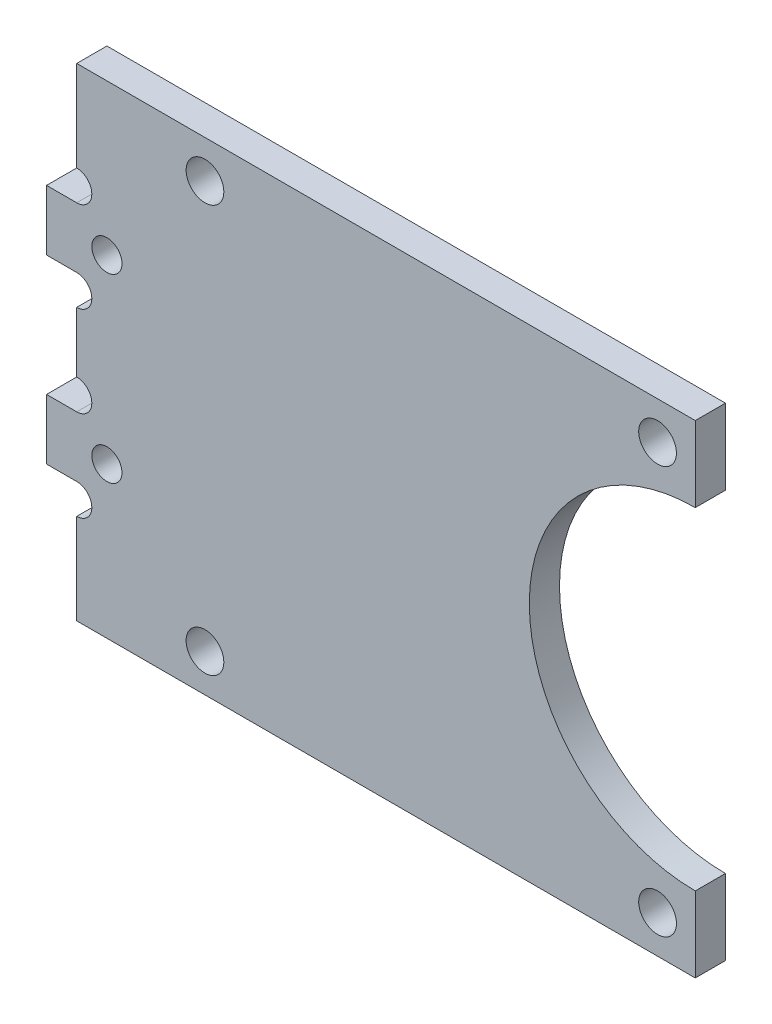
ISO-10303-21;
HEADER;
FILE_DESCRIPTION(('STEP AP214'),'2;1');
FILE_NAME('part.step','',(''),(''),'','','');
FILE_SCHEMA(('AUTOMOTIVE_DESIGN { 1 0 10303 214 1 1 1 1 }'));
ENDSEC;
DATA;
#1=APPLICATION_CONTEXT('core data for automotive mechanical design processes');
#2=APPLICATION_PROTOCOL_DEFINITION('international standard','automotive_design',2000,#1);
#3=PRODUCT_CONTEXT('',#1,'mechanical');
#4=PRODUCT('Part','Part','',(#3));
#5=PRODUCT_RELATED_PRODUCT_CATEGORY('part','',(#4));
#6=PRODUCT_DEFINITION_FORMATION('','',#4);
#7=PRODUCT_DEFINITION_CONTEXT('part definition',#1,'design');
#8=PRODUCT_DEFINITION('design','',#6,#7);
#9=PRODUCT_DEFINITION_SHAPE('','',#8);
#10=(LENGTH_UNIT() NAMED_UNIT(*) SI_UNIT(.MILLI.,.METRE.));
#11=(NAMED_UNIT(*) PLANE_ANGLE_UNIT() SI_UNIT($,.RADIAN.));
#12=(NAMED_UNIT(*) SI_UNIT($,.STERADIAN.) SOLID_ANGLE_UNIT());
#13=UNCERTAINTY_MEASURE_WITH_UNIT(LENGTH_MEASURE(1.E-05),#10,'distance_accuracy_value','');
#14=(GEOMETRIC_REPRESENTATION_CONTEXT(3) GLOBAL_UNCERTAINTY_ASSIGNED_CONTEXT((#13)) GLOBAL_UNIT_ASSIGNED_CONTEXT((#10,
#11,#12)) REPRESENTATION_CONTEXT('',''));
#15=CARTESIAN_POINT('',(0.,0.,0.));
#16=DIRECTION('',(0.,0.,1.));
#17=DIRECTION('',(1.,0.,0.));
#18=AXIS2_PLACEMENT_3D('',#15,#16,#17);
#19=CARTESIAN_POINT('',(15.2837868020581,10.1625,2.));
#20=DIRECTION('',(-1.,0.,0.));
#21=DIRECTION('',(0.,-1.,0.));
#22=AXIS2_PLACEMENT_3D('',#19,#20,#21);
#23=PLANE('',#22);
#24=DIRECTION('',(0.,1.,0.));
#25=VECTOR('',#24,1.);
#26=CARTESIAN_POINT('',(15.2837868020581,10.1625,2.));
#27=LINE('',#26,#25);
#28=CARTESIAN_POINT('',(15.2837868020581,5.1625,2.));
#29=VERTEX_POINT('',#28);
#30=CARTESIAN_POINT('',(15.2837868020581,10.1625,2.));
#31=VERTEX_POINT('',#30);
#32=EDGE_CURVE('E55',#29,#31,#27,.T.);
#33=ORIENTED_EDGE('',*,*,#32,.F.);
#34=DIRECTION('',(0.,0.,-1.));
#35=VECTOR('',#34,1.);
#36=CARTESIAN_POINT('',(15.2837868020581,5.1625,2.));
#37=LINE('',#36,#35);
#38=CARTESIAN_POINT('',(15.2837868020581,5.1625,0.));
#39=VERTEX_POINT('',#38);
#40=EDGE_CURVE('E320',#29,#39,#37,.T.);
#41=ORIENTED_EDGE('',*,*,#40,.T.);
#42=DIRECTION('',(0.,1.,0.));
#43=VECTOR('',#42,1.);
#44=CARTESIAN_POINT('',(15.2837868020581,10.1625,0.));
#45=LINE('',#44,#43);
#46=CARTESIAN_POINT('',(15.2837868020581,10.1625,0.));
#47=VERTEX_POINT('',#46);
#48=EDGE_CURVE('E114',#39,#47,#45,.T.);
#49=ORIENTED_EDGE('',*,*,#48,.T.);
#50=DIRECTION('',(0.,0.,-1.));
#51=VECTOR('',#50,1.);
#52=CARTESIAN_POINT('',(15.2837868020581,10.1625,2.));
#53=LINE('',#52,#51);
#54=EDGE_CURVE('E192',#31,#47,#53,.T.);
#55=ORIENTED_EDGE('',*,*,#54,.F.);
#56=EDGE_LOOP('',(#33,#41,#49,#55));
#57=FACE_BOUND('',#56,.T.);
#58=ADVANCED_FACE('F32',(#57),#23,.F.);
#59=CARTESIAN_POINT('',(-25.7162131979419,3.1625,2.));
#60=DIRECTION('',(0.,0.,1.));
#61=DIRECTION('',(1.,0.,0.));
#62=AXIS2_PLACEMENT_3D('',#59,#60,#61);
#63=PLANE('',#62);
#64=CARTESIAN_POINT('',(15.2837868020581,-5.8375,2.));
#65=DIRECTION('',(0.,0.,-1.));
#66=DIRECTION('',(1.,0.,0.));
#67=AXIS2_PLACEMENT_3D('',#64,#65,#66);
#68=CIRCLE('',#67,11.);
#69=CARTESIAN_POINT('',(15.2837868020581,-16.8375,2.));
#70=VERTEX_POINT('',#69);
#71=EDGE_CURVE('E47',#70,#29,#68,.T.);
#72=ORIENTED_EDGE('',*,*,#71,.T.);
#73=ORIENTED_EDGE('',*,*,#32,.T.);
#74=DIRECTION('',(-1.,0.,0.));
#75=VECTOR('',#74,1.);
#76=CARTESIAN_POINT('',(-17.2162131979419,10.1625,2.));
#77=LINE('',#76,#75);
#78=CARTESIAN_POINT('',(-25.7162131979419,10.1625,2.));
#79=VERTEX_POINT('',#78);
#80=EDGE_CURVE('E119',#31,#79,#77,.T.);
#81=ORIENTED_EDGE('',*,*,#80,.T.);
#82=DIRECTION('',(0.,-1.,0.));
#83=VECTOR('',#82,1.);
#84=CARTESIAN_POINT('',(-25.7162131979419,10.1625,2.));
#85=LINE('',#84,#83);
#86=CARTESIAN_POINT('',(-25.7162131979419,4.1625,2.));
#87=VERTEX_POINT('',#86);
#88=EDGE_CURVE('E368',#79,#87,#85,.T.);
#89=ORIENTED_EDGE('',*,*,#88,.T.);
#90=CARTESIAN_POINT('',(-25.7162131979419,3.1625,2.));
#91=DIRECTION('',(0.,0.,-1.));
#92=DIRECTION('',(1.,0.,0.));
#93=AXIS2_PLACEMENT_3D('',#90,#91,#92);
#94=CIRCLE('',#93,1.);
#95=CARTESIAN_POINT('',(-25.7162131979419,2.1625,2.));
#96=VERTEX_POINT('',#95);
#97=EDGE_CURVE('E265',#87,#96,#94,.T.);
#98=ORIENTED_EDGE('',*,*,#97,.T.);
#99=DIRECTION('',(-1.,0.,0.));
#100=VECTOR('',#99,1.);
#101=CARTESIAN_POINT('',(-25.7162131979419,2.1625,2.));
#102=LINE('',#101,#100);
#103=CARTESIAN_POINT('',(-27.7162131979419,2.1625,2.));
#104=VERTEX_POINT('',#103);
#105=EDGE_CURVE('E287',#96,#104,#102,.T.);
#106=ORIENTED_EDGE('',*,*,#105,.T.);
#107=DIRECTION('',(0.,-1.,0.));
#108=VECTOR('',#107,1.);
#109=CARTESIAN_POINT('',(-27.7162131979419,2.1625,2.));
#110=LINE('',#109,#108);
#111=CARTESIAN_POINT('',(-27.7162131979419,-1.8375,2.));
#112=VERTEX_POINT('',#111);
#113=EDGE_CURVE('E284',#104,#112,#110,.T.);
#114=ORIENTED_EDGE('',*,*,#113,.T.);
#115=DIRECTION('',(1.,0.,0.));
#116=VECTOR('',#115,1.);
#117=CARTESIAN_POINT('',(-25.7162131979419,-1.8375,2.));
#118=LINE('',#117,#116);
#119=CARTESIAN_POINT('',(-25.7162131979419,-1.8375,2.));
#120=VERTEX_POINT('',#119);
#121=EDGE_CURVE('E286',#112,#120,#118,.T.);
#122=ORIENTED_EDGE('',*,*,#121,.T.);
#123=CARTESIAN_POINT('',(-25.7162131979419,-2.8375,2.));
#124=DIRECTION('',(0.,0.,-1.));
#125=DIRECTION('',(-1.,0.,0.));
#126=AXIS2_PLACEMENT_3D('',#123,#124,#125);
#127=CIRCLE('',#126,1.);
#128=CARTESIAN_POINT('',(-25.7162131979419,-3.8375,2.));
#129=VERTEX_POINT('',#128);
#130=EDGE_CURVE('E289',#120,#129,#127,.T.);
#131=ORIENTED_EDGE('',*,*,#130,.T.);
#132=DIRECTION('',(0.,-1.,0.));
#133=VECTOR('',#132,1.);
#134=CARTESIAN_POINT('',(-25.7162131979419,-3.8375,2.));
#135=LINE('',#134,#133);
#136=CARTESIAN_POINT('',(-25.7162131979419,-7.8375,2.));
#137=VERTEX_POINT('',#136);
#138=EDGE_CURVE('E295',#129,#137,#135,.T.);
#139=ORIENTED_EDGE('',*,*,#138,.T.);
#140=CARTESIAN_POINT('',(-25.7162131979419,-8.8375,2.));
#141=DIRECTION('',(0.,0.,-1.));
#142=DIRECTION('',(1.,0.,0.));
#143=AXIS2_PLACEMENT_3D('',#140,#141,#142);
#144=CIRCLE('',#143,1.);
#145=CARTESIAN_POINT('',(-25.7162131979419,-9.8375,2.));
#146=VERTEX_POINT('',#145);
#147=EDGE_CURVE('E297',#137,#146,#144,.T.);
#148=ORIENTED_EDGE('',*,*,#147,.T.);
#149=DIRECTION('',(-1.,0.,0.));
#150=VECTOR('',#149,1.);
#151=CARTESIAN_POINT('',(-25.7162131979419,-9.8375,2.));
#152=LINE('',#151,#150);
#153=CARTESIAN_POINT('',(-27.7162131979419,-9.8375,2.));
#154=VERTEX_POINT('',#153);
#155=EDGE_CURVE('E299',#146,#154,#152,.T.);
#156=ORIENTED_EDGE('',*,*,#155,.T.);
#157=DIRECTION('',(0.,-1.,0.));
#158=VECTOR('',#157,1.);
#159=CARTESIAN_POINT('',(-27.7162131979419,-9.8375,2.));
#160=LINE('',#159,#158);
#161=CARTESIAN_POINT('',(-27.7162131979419,-13.8375,2.));
#162=VERTEX_POINT('',#161);
#163=EDGE_CURVE('E301',#154,#162,#160,.T.);
#164=ORIENTED_EDGE('',*,*,#163,.T.);
#165=DIRECTION('',(1.,0.,0.));
#166=VECTOR('',#165,1.);
#167=CARTESIAN_POINT('',(-25.7162131979419,-13.8375,2.));
#168=LINE('',#167,#166);
#169=CARTESIAN_POINT('',(-25.7162131979419,-13.8375,2.));
#170=VERTEX_POINT('',#169);
#171=EDGE_CURVE('E303',#162,#170,#168,.T.);
#172=ORIENTED_EDGE('',*,*,#171,.T.);
#173=CARTESIAN_POINT('',(-25.7162131979419,-14.8375,2.));
#174=DIRECTION('',(0.,0.,-1.));
#175=DIRECTION('',(-1.,0.,0.));
#176=AXIS2_PLACEMENT_3D('',#173,#174,#175);
#177=CIRCLE('',#176,0.999999999999999);
#178=CARTESIAN_POINT('',(-25.7162131979419,-15.8375,2.));
#179=VERTEX_POINT('',#178);
#180=EDGE_CURVE('E169',#170,#179,#177,.T.);
#181=ORIENTED_EDGE('',*,*,#180,.T.);
#182=DIRECTION('',(0.,-1.,0.));
#183=VECTOR('',#182,1.);
#184=CARTESIAN_POINT('',(-25.7162131979419,-15.8375,2.));
#185=LINE('',#184,#183);
#186=CARTESIAN_POINT('',(-25.7162131979419,-21.8375,2.));
#187=VERTEX_POINT('',#186);
#188=EDGE_CURVE('E160',#179,#187,#185,.T.);
#189=ORIENTED_EDGE('',*,*,#188,.T.);
#190=DIRECTION('',(1.,0.,0.));
#191=VECTOR('',#190,1.);
#192=CARTESIAN_POINT('',(-19.7162131979419,-21.8375,2.));
#193=LINE('',#192,#191);
#194=CARTESIAN_POINT('',(15.2837868020581,-21.8375,2.));
#195=VERTEX_POINT('',#194);
#196=EDGE_CURVE('E166',#187,#195,#193,.T.);
#197=ORIENTED_EDGE('',*,*,#196,.T.);
#198=EDGE_CURVE('E188',#195,#70,#27,.T.);
#199=ORIENTED_EDGE('',*,*,#198,.T.);
#200=EDGE_LOOP('',(#72,#73,#81,#89,#98,#106,#114,#122,#131,#139,#148,#156,#164,#172,#181,#189,
#197,#199));
#201=FACE_BOUND('',#200,.T.);
#202=CARTESIAN_POINT('',(-23.7162131979419,-11.8375,2.));
#203=DIRECTION('',(0.,0.,1.));
#204=DIRECTION('',(1.,0.,0.));
#205=AXIS2_PLACEMENT_3D('',#202,#203,#204);
#206=CIRCLE('',#205,1.);
#207=CARTESIAN_POINT('',(-22.7162131979419,-11.8375,2.));
#208=VERTEX_POINT('',#207);
#209=EDGE_CURVE('E339',#208,#208,#206,.T.);
#210=ORIENTED_EDGE('',*,*,#209,.F.);
#211=EDGE_LOOP('',(#210));
#212=FACE_BOUND('',#211,.T.);
#213=CARTESIAN_POINT('',(12.7837868020581,7.6625,2.));
#214=DIRECTION('',(0.,0.,1.));
#215=DIRECTION('',(1.,0.,0.));
#216=AXIS2_PLACEMENT_3D('',#213,#214,#215);
#217=CIRCLE('',#216,1.25);
#218=CARTESIAN_POINT('',(14.0337868020581,7.6625,2.));
#219=VERTEX_POINT('',#218);
#220=EDGE_CURVE('E351',#219,#219,#217,.T.);
#221=ORIENTED_EDGE('',*,*,#220,.F.);
#222=EDGE_LOOP('',(#221));
#223=FACE_BOUND('',#222,.T.);
#224=CARTESIAN_POINT('',(-17.2162131979419,7.6625,2.));
#225=DIRECTION('',(0.,0.,1.));
#226=DIRECTION('',(1.,0.,0.));
#227=AXIS2_PLACEMENT_3D('',#224,#225,#226);
#228=CIRCLE('',#227,1.25);
#229=CARTESIAN_POINT('',(-15.9662131979419,7.6625,2.));
#230=VERTEX_POINT('',#229);
#231=EDGE_CURVE('E196',#230,#230,#228,.T.);
#232=ORIENTED_EDGE('',*,*,#231,.F.);
#233=EDGE_LOOP('',(#232));
#234=FACE_BOUND('',#233,.T.);
#235=CARTESIAN_POINT('',(12.7837868020581,-19.3375,2.));
#236=DIRECTION('',(0.,0.,1.));
#237=DIRECTION('',(1.,0.,0.));
#238=AXIS2_PLACEMENT_3D('',#235,#236,#237);
#239=CIRCLE('',#238,1.25);
#240=CARTESIAN_POINT('',(14.0337868020581,-19.3375,2.));
#241=VERTEX_POINT('',#240);
#242=EDGE_CURVE('E357',#241,#241,#239,.T.);
#243=ORIENTED_EDGE('',*,*,#242,.F.);
#244=EDGE_LOOP('',(#243));
#245=FACE_BOUND('',#244,.T.);
#246=CARTESIAN_POINT('',(-17.2162131979419,-19.3375,2.));
#247=DIRECTION('',(0.,0.,1.));
#248=DIRECTION('',(1.,0.,0.));
#249=AXIS2_PLACEMENT_3D('',#246,#247,#248);
#250=CIRCLE('',#249,1.25);
#251=CARTESIAN_POINT('',(-15.9662131979419,-19.3375,2.));
#252=VERTEX_POINT('',#251);
#253=EDGE_CURVE('E345',#252,#252,#250,.T.);
#254=ORIENTED_EDGE('',*,*,#253,.F.);
#255=EDGE_LOOP('',(#254));
#256=FACE_BOUND('',#255,.T.);
#257=CARTESIAN_POINT('',(-23.7162131979419,0.162500000000001,2.));
#258=DIRECTION('',(0.,0.,1.));
#259=DIRECTION('',(1.,0.,0.));
#260=AXIS2_PLACEMENT_3D('',#257,#258,#259);
#261=CIRCLE('',#260,1.);
#262=CARTESIAN_POINT('',(-22.7162131979419,0.162500000000001,2.));
#263=VERTEX_POINT('',#262);
#264=EDGE_CURVE('E331',#263,#263,#261,.T.);
#265=ORIENTED_EDGE('',*,*,#264,.F.);
#266=EDGE_LOOP('',(#265));
#267=FACE_BOUND('',#266,.T.);
#268=ADVANCED_FACE('F162',(#201,#212,#223,#234,#245,#256,#267),#63,.T.);
#269=CARTESIAN_POINT('',(-25.7162131979419,3.1625,0.));
#270=DIRECTION('',(0.,0.,1.));
#271=DIRECTION('',(1.,0.,0.));
#272=AXIS2_PLACEMENT_3D('',#269,#270,#271);
#273=PLANE('',#272);
#274=ORIENTED_EDGE('',*,*,#48,.F.);
#275=CARTESIAN_POINT('',(15.2837868020581,-5.8375,0.));
#276=DIRECTION('',(0.,0.,-1.));
#277=DIRECTION('',(1.,0.,0.));
#278=AXIS2_PLACEMENT_3D('',#275,#276,#277);
#279=CIRCLE('',#278,11.);
#280=CARTESIAN_POINT('',(15.2837868020581,-16.8375,0.));
#281=VERTEX_POINT('',#280);
#282=EDGE_CURVE('E321',#281,#39,#279,.T.);
#283=ORIENTED_EDGE('',*,*,#282,.F.);
#284=CARTESIAN_POINT('',(15.2837868020581,-21.8375,0.));
#285=VERTEX_POINT('',#284);
#286=EDGE_CURVE('E221',#285,#281,#45,.T.);
#287=ORIENTED_EDGE('',*,*,#286,.F.);
#288=DIRECTION('',(1.,0.,0.));
#289=VECTOR('',#288,1.);
#290=CARTESIAN_POINT('',(15.2837868020581,-21.8375,0.));
#291=LINE('',#290,#289);
#292=CARTESIAN_POINT('',(-25.7162131979419,-21.8375,0.));
#293=VERTEX_POINT('',#292);
#294=EDGE_CURVE('E219',#293,#285,#291,.T.);
#295=ORIENTED_EDGE('',*,*,#294,.F.);
#296=DIRECTION('',(0.,-1.,0.));
#297=VECTOR('',#296,1.);
#298=CARTESIAN_POINT('',(-25.7162131979419,-15.8375,0.));
#299=LINE('',#298,#297);
#300=CARTESIAN_POINT('',(-25.7162131979419,-15.8375,0.));
#301=VERTEX_POINT('',#300);
#302=EDGE_CURVE('E179',#301,#293,#299,.T.);
#303=ORIENTED_EDGE('',*,*,#302,.F.);
#304=CARTESIAN_POINT('',(-25.7162131979419,-14.8375,0.));
#305=DIRECTION('',(0.,0.,-1.));
#306=DIRECTION('',(-1.,0.,0.));
#307=AXIS2_PLACEMENT_3D('',#304,#305,#306);
#308=CIRCLE('',#307,0.999999999999999);
#309=CARTESIAN_POINT('',(-25.7162131979419,-13.8375,0.));
#310=VERTEX_POINT('',#309);
#311=EDGE_CURVE('E216',#310,#301,#308,.T.);
#312=ORIENTED_EDGE('',*,*,#311,.F.);
#313=DIRECTION('',(1.,0.,0.));
#314=VECTOR('',#313,1.);
#315=CARTESIAN_POINT('',(-25.7162131979419,-13.8375,0.));
#316=LINE('',#315,#314);
#317=CARTESIAN_POINT('',(-27.7162131979419,-13.8375,0.));
#318=VERTEX_POINT('',#317);
#319=EDGE_CURVE('E214',#318,#310,#316,.T.);
#320=ORIENTED_EDGE('',*,*,#319,.F.);
#321=DIRECTION('',(0.,-1.,0.));
#322=VECTOR('',#321,1.);
#323=CARTESIAN_POINT('',(-27.7162131979419,-9.8375,0.));
#324=LINE('',#323,#322);
#325=CARTESIAN_POINT('',(-27.7162131979419,-9.8375,0.));
#326=VERTEX_POINT('',#325);
#327=EDGE_CURVE('E212',#326,#318,#324,.T.);
#328=ORIENTED_EDGE('',*,*,#327,.F.);
#329=DIRECTION('',(-1.,0.,0.));
#330=VECTOR('',#329,1.);
#331=CARTESIAN_POINT('',(-25.7162131979419,-9.8375,0.));
#332=LINE('',#331,#330);
#333=CARTESIAN_POINT('',(-25.7162131979419,-9.8375,0.));
#334=VERTEX_POINT('',#333);
#335=EDGE_CURVE('E210',#334,#326,#332,.T.);
#336=ORIENTED_EDGE('',*,*,#335,.F.);
#337=CARTESIAN_POINT('',(-25.7162131979419,-8.8375,0.));
#338=DIRECTION('',(0.,0.,-1.));
#339=DIRECTION('',(1.,0.,0.));
#340=AXIS2_PLACEMENT_3D('',#337,#338,#339);
#341=CIRCLE('',#340,1.);
#342=CARTESIAN_POINT('',(-25.7162131979419,-7.8375,0.));
#343=VERTEX_POINT('',#342);
#344=EDGE_CURVE('E208',#343,#334,#341,.T.);
#345=ORIENTED_EDGE('',*,*,#344,.F.);
#346=DIRECTION('',(0.,-1.,0.));
#347=VECTOR('',#346,1.);
#348=CARTESIAN_POINT('',(-25.7162131979419,-3.8375,0.));
#349=LINE('',#348,#347);
#350=CARTESIAN_POINT('',(-25.7162131979419,-3.8375,0.));
#351=VERTEX_POINT('',#350);
#352=EDGE_CURVE('E206',#351,#343,#349,.T.);
#353=ORIENTED_EDGE('',*,*,#352,.F.);
#354=CARTESIAN_POINT('',(-25.7162131979419,-2.8375,0.));
#355=DIRECTION('',(0.,0.,-1.));
#356=DIRECTION('',(-1.,0.,0.));
#357=AXIS2_PLACEMENT_3D('',#354,#355,#356);
#358=CIRCLE('',#357,1.);
#359=CARTESIAN_POINT('',(-25.7162131979419,-1.8375,0.));
#360=VERTEX_POINT('',#359);
#361=EDGE_CURVE('E204',#360,#351,#358,.T.);
#362=ORIENTED_EDGE('',*,*,#361,.F.);
#363=DIRECTION('',(1.,0.,0.));
#364=VECTOR('',#363,1.);
#365=CARTESIAN_POINT('',(-25.7162131979419,-1.8375,0.));
#366=LINE('',#365,#364);
#367=CARTESIAN_POINT('',(-27.7162131979419,-1.8375,0.));
#368=VERTEX_POINT('',#367);
#369=EDGE_CURVE('E202',#368,#360,#366,.T.);
#370=ORIENTED_EDGE('',*,*,#369,.F.);
#371=DIRECTION('',(0.,-1.,0.));
#372=VECTOR('',#371,1.);
#373=CARTESIAN_POINT('',(-27.7162131979419,2.1625,0.));
#374=LINE('',#373,#372);
#375=CARTESIAN_POINT('',(-27.7162131979419,2.1625,0.));
#376=VERTEX_POINT('',#375);
#377=EDGE_CURVE('E200',#376,#368,#374,.T.);
#378=ORIENTED_EDGE('',*,*,#377,.F.);
#379=DIRECTION('',(-1.,0.,0.));
#380=VECTOR('',#379,1.);
#381=CARTESIAN_POINT('',(-25.7162131979419,2.1625,0.));
#382=LINE('',#381,#380);
#383=CARTESIAN_POINT('',(-25.7162131979419,2.1625,0.));
#384=VERTEX_POINT('',#383);
#385=EDGE_CURVE('E198',#384,#376,#382,.T.);
#386=ORIENTED_EDGE('',*,*,#385,.F.);
#387=CARTESIAN_POINT('',(-25.7162131979419,3.1625,0.));
#388=DIRECTION('',(0.,0.,-1.));
#389=DIRECTION('',(1.,0.,0.));
#390=AXIS2_PLACEMENT_3D('',#387,#388,#389);
#391=CIRCLE('',#390,1.);
#392=CARTESIAN_POINT('',(-25.7162131979419,4.1625,0.));
#393=VERTEX_POINT('',#392);
#394=EDGE_CURVE('E195',#393,#384,#391,.T.);
#395=ORIENTED_EDGE('',*,*,#394,.F.);
#396=DIRECTION('',(0.,-1.,0.));
#397=VECTOR('',#396,1.);
#398=CARTESIAN_POINT('',(-25.7162131979419,10.1625,0.));
#399=LINE('',#398,#397);
#400=CARTESIAN_POINT('',(-25.7162131979419,10.1625,0.));
#401=VERTEX_POINT('',#400);
#402=EDGE_CURVE('E193',#401,#393,#399,.T.);
#403=ORIENTED_EDGE('',*,*,#402,.F.);
#404=DIRECTION('',(-1.,0.,0.));
#405=VECTOR('',#404,1.);
#406=CARTESIAN_POINT('',(-17.2162131979419,10.1625,0.));
#407=LINE('',#406,#405);
#408=EDGE_CURVE('E224',#47,#401,#407,.T.);
#409=ORIENTED_EDGE('',*,*,#408,.F.);
#410=EDGE_LOOP('',(#274,#283,#287,#295,#303,#312,#320,#328,#336,#345,#353,#362,#370,#378,#386,
#395,#403,#409));
#411=FACE_BOUND('',#410,.T.);
#412=CARTESIAN_POINT('',(-17.2162131979419,7.6625,0.));
#413=DIRECTION('',(0.,0.,1.));
#414=DIRECTION('',(1.,0.,0.));
#415=AXIS2_PLACEMENT_3D('',#412,#413,#414);
#416=CIRCLE('',#415,1.25);
#417=CARTESIAN_POINT('',(-15.9662131979419,7.6625,0.));
#418=VERTEX_POINT('',#417);
#419=EDGE_CURVE('E360',#418,#418,#416,.T.);
#420=ORIENTED_EDGE('',*,*,#419,.T.);
#421=EDGE_LOOP('',(#420));
#422=FACE_BOUND('',#421,.T.);
#423=CARTESIAN_POINT('',(12.7837868020581,-19.3375,0.));
#424=DIRECTION('',(0.,0.,1.));
#425=DIRECTION('',(1.,0.,0.));
#426=AXIS2_PLACEMENT_3D('',#423,#424,#425);
#427=CIRCLE('',#426,1.25);
#428=CARTESIAN_POINT('',(14.0337868020581,-19.3375,0.));
#429=VERTEX_POINT('',#428);
#430=EDGE_CURVE('E354',#429,#429,#427,.T.);
#431=ORIENTED_EDGE('',*,*,#430,.T.);
#432=EDGE_LOOP('',(#431));
#433=FACE_BOUND('',#432,.T.);
#434=CARTESIAN_POINT('',(12.7837868020581,7.6625,0.));
#435=DIRECTION('',(0.,0.,1.));
#436=DIRECTION('',(1.,0.,0.));
#437=AXIS2_PLACEMENT_3D('',#434,#435,#436);
#438=CIRCLE('',#437,1.25);
#439=CARTESIAN_POINT('',(14.0337868020581,7.6625,0.));
#440=VERTEX_POINT('',#439);
#441=EDGE_CURVE('E348',#440,#440,#438,.T.);
#442=ORIENTED_EDGE('',*,*,#441,.T.);
#443=EDGE_LOOP('',(#442));
#444=FACE_BOUND('',#443,.T.);
#445=CARTESIAN_POINT('',(-17.2162131979419,-19.3375,0.));
#446=DIRECTION('',(0.,0.,1.));
#447=DIRECTION('',(1.,0.,0.));
#448=AXIS2_PLACEMENT_3D('',#445,#446,#447);
#449=CIRCLE('',#448,1.25);
#450=CARTESIAN_POINT('',(-15.9662131979419,-19.3375,0.));
#451=VERTEX_POINT('',#450);
#452=EDGE_CURVE('E342',#451,#451,#449,.T.);
#453=ORIENTED_EDGE('',*,*,#452,.T.);
#454=EDGE_LOOP('',(#453));
#455=FACE_BOUND('',#454,.T.);
#456=CARTESIAN_POINT('',(-23.7162131979419,-11.8375,0.));
#457=DIRECTION('',(0.,0.,1.));
#458=DIRECTION('',(1.,0.,0.));
#459=AXIS2_PLACEMENT_3D('',#456,#457,#458);
#460=CIRCLE('',#459,1.);
#461=CARTESIAN_POINT('',(-22.7162131979419,-11.8375,0.));
#462=VERTEX_POINT('',#461);
#463=EDGE_CURVE('E337',#462,#462,#460,.T.);
#464=ORIENTED_EDGE('',*,*,#463,.T.);
#465=EDGE_LOOP('',(#464));
#466=FACE_BOUND('',#465,.T.);
#467=CARTESIAN_POINT('',(-23.7162131979419,0.162500000000001,0.));
#468=DIRECTION('',(0.,0.,1.));
#469=DIRECTION('',(1.,0.,0.));
#470=AXIS2_PLACEMENT_3D('',#467,#468,#469);
#471=CIRCLE('',#470,1.);
#472=CARTESIAN_POINT('',(-22.7162131979419,0.162500000000001,0.));
#473=VERTEX_POINT('',#472);
#474=EDGE_CURVE('E328',#473,#473,#471,.T.);
#475=ORIENTED_EDGE('',*,*,#474,.T.);
#476=EDGE_LOOP('',(#475));
#477=FACE_BOUND('',#476,.T.);
#478=ADVANCED_FACE('F271',(#411,#422,#433,#444,#455,#466,#477),#273,.F.);
#479=CARTESIAN_POINT('',(-25.7162131979419,10.1625,2.));
#480=DIRECTION('',(1.,0.,0.));
#481=DIRECTION('',(0.,0.,-1.));
#482=AXIS2_PLACEMENT_3D('',#479,#480,#481);
#483=PLANE('',#482);
#484=ORIENTED_EDGE('',*,*,#402,.T.);
#485=DIRECTION('',(0.,0.,-1.));
#486=VECTOR('',#485,1.);
#487=CARTESIAN_POINT('',(-25.7162131979419,4.1625,2.));
#488=LINE('',#487,#486);
#489=EDGE_CURVE('E40',#87,#393,#488,.T.);
#490=ORIENTED_EDGE('',*,*,#489,.F.);
#491=ORIENTED_EDGE('',*,*,#88,.F.);
#492=DIRECTION('',(0.,0.,-1.));
#493=VECTOR('',#492,1.);
#494=CARTESIAN_POINT('',(-25.7162131979419,10.1625,2.));
#495=LINE('',#494,#493);
#496=EDGE_CURVE('E11',#79,#401,#495,.T.);
#497=ORIENTED_EDGE('',*,*,#496,.T.);
#498=EDGE_LOOP('',(#484,#490,#491,#497));
#499=FACE_BOUND('',#498,.T.);
#500=ADVANCED_FACE('F34',(#499),#483,.F.);
#501=CARTESIAN_POINT('',(-25.7162131979419,3.1625,2.));
#502=DIRECTION('',(0.,0.,-1.));
#503=DIRECTION('',(-1.,0.,0.));
#504=AXIS2_PLACEMENT_3D('',#501,#502,#503);
#505=CYLINDRICAL_SURFACE('',#504,1.);
#506=ORIENTED_EDGE('',*,*,#394,.T.);
#507=DIRECTION('',(0.,0.,-1.));
#508=VECTOR('',#507,1.);
#509=CARTESIAN_POINT('',(-25.7162131979419,2.1625,2.));
#510=LINE('',#509,#508);
#511=EDGE_CURVE('E256',#96,#384,#510,.T.);
#512=ORIENTED_EDGE('',*,*,#511,.F.);
#513=ORIENTED_EDGE('',*,*,#97,.F.);
#514=ORIENTED_EDGE('',*,*,#489,.T.);
#515=EDGE_LOOP('',(#506,#512,#513,#514));
#516=FACE_BOUND('',#515,.T.);
#517=ADVANCED_FACE('F263',(#516),#505,.F.);
#518=CARTESIAN_POINT('',(-25.7162131979419,2.1625,2.));
#519=DIRECTION('',(0.,-1.,0.));
#520=DIRECTION('',(0.,0.,-1.));
#521=AXIS2_PLACEMENT_3D('',#518,#519,#520);
#522=PLANE('',#521);
#523=ORIENTED_EDGE('',*,*,#385,.T.);
#524=DIRECTION('',(0.,0.,-1.));
#525=VECTOR('',#524,1.);
#526=CARTESIAN_POINT('',(-27.7162131979419,2.1625,2.));
#527=LINE('',#526,#525);
#528=EDGE_CURVE('E253',#104,#376,#527,.T.);
#529=ORIENTED_EDGE('',*,*,#528,.F.);
#530=ORIENTED_EDGE('',*,*,#105,.F.);
#531=ORIENTED_EDGE('',*,*,#511,.T.);
#532=EDGE_LOOP('',(#523,#529,#530,#531));
#533=FACE_BOUND('',#532,.T.);
#534=ADVANCED_FACE('F278',(#533),#522,.F.);
#535=CARTESIAN_POINT('',(-27.7162131979419,2.1625,2.));
#536=DIRECTION('',(1.,0.,0.));
#537=DIRECTION('',(0.,0.,-1.));
#538=AXIS2_PLACEMENT_3D('',#535,#536,#537);
#539=PLANE('',#538);
#540=ORIENTED_EDGE('',*,*,#377,.T.);
#541=DIRECTION('',(0.,0.,-1.));
#542=VECTOR('',#541,1.);
#543=CARTESIAN_POINT('',(-27.7162131979419,-1.8375,2.));
#544=LINE('',#543,#542);
#545=EDGE_CURVE('E250',#112,#368,#544,.T.);
#546=ORIENTED_EDGE('',*,*,#545,.F.);
#547=ORIENTED_EDGE('',*,*,#113,.F.);
#548=ORIENTED_EDGE('',*,*,#528,.T.);
#549=EDGE_LOOP('',(#540,#546,#547,#548));
#550=FACE_BOUND('',#549,.T.);
#551=ADVANCED_FACE('F282',(#550),#539,.F.);
#552=CARTESIAN_POINT('',(-25.7162131979419,-1.8375,2.));
#553=DIRECTION('',(0.,1.,0.));
#554=DIRECTION('',(0.,0.,1.));
#555=AXIS2_PLACEMENT_3D('',#552,#553,#554);
#556=PLANE('',#555);
#557=ORIENTED_EDGE('',*,*,#369,.T.);
#558=DIRECTION('',(0.,0.,-1.));
#559=VECTOR('',#558,1.);
#560=CARTESIAN_POINT('',(-25.7162131979419,-1.8375,2.));
#561=LINE('',#560,#559);
#562=EDGE_CURVE('E247',#120,#360,#561,.T.);
#563=ORIENTED_EDGE('',*,*,#562,.F.);
#564=ORIENTED_EDGE('',*,*,#121,.F.);
#565=ORIENTED_EDGE('',*,*,#545,.T.);
#566=EDGE_LOOP('',(#557,#563,#564,#565));
#567=FACE_BOUND('',#566,.T.);
#568=ADVANCED_FACE('F417',(#567),#556,.F.);
#569=CARTESIAN_POINT('',(-25.7162131979419,-2.8375,2.));
#570=DIRECTION('',(0.,0.,-1.));
#571=DIRECTION('',(-1.,0.,0.));
#572=AXIS2_PLACEMENT_3D('',#569,#570,#571);
#573=CYLINDRICAL_SURFACE('',#572,1.);
#574=ORIENTED_EDGE('',*,*,#361,.T.);
#575=DIRECTION('',(0.,0.,-1.));
#576=VECTOR('',#575,1.);
#577=CARTESIAN_POINT('',(-25.7162131979419,-3.8375,2.));
#578=LINE('',#577,#576);
#579=EDGE_CURVE('E244',#129,#351,#578,.T.);
#580=ORIENTED_EDGE('',*,*,#579,.F.);
#581=ORIENTED_EDGE('',*,*,#130,.F.);
#582=ORIENTED_EDGE('',*,*,#562,.T.);
#583=EDGE_LOOP('',(#574,#580,#581,#582));
#584=FACE_BOUND('',#583,.T.);
#585=ADVANCED_FACE('F413',(#584),#573,.F.);
#586=CARTESIAN_POINT('',(-25.7162131979419,-3.8375,2.));
#587=DIRECTION('',(1.,0.,0.));
#588=DIRECTION('',(0.,0.,-1.));
#589=AXIS2_PLACEMENT_3D('',#586,#587,#588);
#590=PLANE('',#589);
#591=ORIENTED_EDGE('',*,*,#352,.T.);
#592=DIRECTION('',(0.,0.,-1.));
#593=VECTOR('',#592,1.);
#594=CARTESIAN_POINT('',(-25.7162131979419,-7.8375,2.));
#595=LINE('',#594,#593);
#596=EDGE_CURVE('E241',#137,#343,#595,.T.);
#597=ORIENTED_EDGE('',*,*,#596,.F.);
#598=ORIENTED_EDGE('',*,*,#138,.F.);
#599=ORIENTED_EDGE('',*,*,#579,.T.);
#600=EDGE_LOOP('',(#591,#597,#598,#599));
#601=FACE_BOUND('',#600,.T.);
#602=ADVANCED_FACE('F409',(#601),#590,.F.);
#603=CARTESIAN_POINT('',(-25.7162131979419,-8.8375,2.));
#604=DIRECTION('',(0.,0.,-1.));
#605=DIRECTION('',(-1.,0.,0.));
#606=AXIS2_PLACEMENT_3D('',#603,#604,#605);
#607=CYLINDRICAL_SURFACE('',#606,1.);
#608=ORIENTED_EDGE('',*,*,#344,.T.);
#609=DIRECTION('',(0.,0.,-1.));
#610=VECTOR('',#609,1.);
#611=CARTESIAN_POINT('',(-25.7162131979419,-9.8375,2.));
#612=LINE('',#611,#610);
#613=EDGE_CURVE('E238',#146,#334,#612,.T.);
#614=ORIENTED_EDGE('',*,*,#613,.F.);
#615=ORIENTED_EDGE('',*,*,#147,.F.);
#616=ORIENTED_EDGE('',*,*,#596,.T.);
#617=EDGE_LOOP('',(#608,#614,#615,#616));
#618=FACE_BOUND('',#617,.T.);
#619=ADVANCED_FACE('F405',(#618),#607,.F.);
#620=CARTESIAN_POINT('',(-25.7162131979419,-9.8375,2.));
#621=DIRECTION('',(0.,-1.,0.));
#622=DIRECTION('',(0.,0.,-1.));
#623=AXIS2_PLACEMENT_3D('',#620,#621,#622);
#624=PLANE('',#623);
#625=ORIENTED_EDGE('',*,*,#335,.T.);
#626=DIRECTION('',(0.,0.,-1.));
#627=VECTOR('',#626,1.);
#628=CARTESIAN_POINT('',(-27.7162131979419,-9.8375,2.));
#629=LINE('',#628,#627);
#630=EDGE_CURVE('E235',#154,#326,#629,.T.);
#631=ORIENTED_EDGE('',*,*,#630,.F.);
#632=ORIENTED_EDGE('',*,*,#155,.F.);
#633=ORIENTED_EDGE('',*,*,#613,.T.);
#634=EDGE_LOOP('',(#625,#631,#632,#633));
#635=FACE_BOUND('',#634,.T.);
#636=ADVANCED_FACE('F401',(#635),#624,.F.);
#637=CARTESIAN_POINT('',(-27.7162131979419,-9.8375,2.));
#638=DIRECTION('',(1.,0.,0.));
#639=DIRECTION('',(0.,0.,-1.));
#640=AXIS2_PLACEMENT_3D('',#637,#638,#639);
#641=PLANE('',#640);
#642=ORIENTED_EDGE('',*,*,#327,.T.);
#643=DIRECTION('',(0.,0.,-1.));
#644=VECTOR('',#643,1.);
#645=CARTESIAN_POINT('',(-27.7162131979419,-13.8375,2.));
#646=LINE('',#645,#644);
#647=EDGE_CURVE('E232',#162,#318,#646,.T.);
#648=ORIENTED_EDGE('',*,*,#647,.F.);
#649=ORIENTED_EDGE('',*,*,#163,.F.);
#650=ORIENTED_EDGE('',*,*,#630,.T.);
#651=EDGE_LOOP('',(#642,#648,#649,#650));
#652=FACE_BOUND('',#651,.T.);
#653=ADVANCED_FACE('F398',(#652),#641,.F.);
#654=CARTESIAN_POINT('',(-25.7162131979419,-13.8375,2.));
#655=DIRECTION('',(0.,1.,0.));
#656=DIRECTION('',(0.,0.,1.));
#657=AXIS2_PLACEMENT_3D('',#654,#655,#656);
#658=PLANE('',#657);
#659=ORIENTED_EDGE('',*,*,#319,.T.);
#660=DIRECTION('',(0.,0.,-1.));
#661=VECTOR('',#660,1.);
#662=CARTESIAN_POINT('',(-25.7162131979419,-13.8375,2.));
#663=LINE('',#662,#661);
#664=EDGE_CURVE('E229',#170,#310,#663,.T.);
#665=ORIENTED_EDGE('',*,*,#664,.F.);
#666=ORIENTED_EDGE('',*,*,#171,.F.);
#667=ORIENTED_EDGE('',*,*,#647,.T.);
#668=EDGE_LOOP('',(#659,#665,#666,#667));
#669=FACE_BOUND('',#668,.T.);
#670=ADVANCED_FACE('F309',(#669),#658,.F.);
#671=CARTESIAN_POINT('',(-25.7162131979419,-14.8375,2.));
#672=DIRECTION('',(0.,0.,-1.));
#673=DIRECTION('',(-1.,0.,0.));
#674=AXIS2_PLACEMENT_3D('',#671,#672,#673);
#675=CYLINDRICAL_SURFACE('',#674,0.999999999999999);
#676=ORIENTED_EDGE('',*,*,#311,.T.);
#677=DIRECTION('',(0.,0.,-1.));
#678=VECTOR('',#677,1.);
#679=CARTESIAN_POINT('',(-25.7162131979419,-15.8375,2.));
#680=LINE('',#679,#678);
#681=EDGE_CURVE('E181',#179,#301,#680,.T.);
#682=ORIENTED_EDGE('',*,*,#681,.F.);
#683=ORIENTED_EDGE('',*,*,#180,.F.);
#684=ORIENTED_EDGE('',*,*,#664,.T.);
#685=EDGE_LOOP('',(#676,#682,#683,#684));
#686=FACE_BOUND('',#685,.T.);
#687=ADVANCED_FACE('F313',(#686),#675,.F.);
#688=CARTESIAN_POINT('',(-25.7162131979419,-15.8375,2.));
#689=DIRECTION('',(1.,0.,0.));
#690=DIRECTION('',(0.,1.,0.));
#691=AXIS2_PLACEMENT_3D('',#688,#689,#690);
#692=PLANE('',#691);
#693=ORIENTED_EDGE('',*,*,#302,.T.);
#694=DIRECTION('',(0.,0.,-1.));
#695=VECTOR('',#694,1.);
#696=CARTESIAN_POINT('',(-25.7162131979419,-21.8375,2.));
#697=LINE('',#696,#695);
#698=EDGE_CURVE('E176',#187,#293,#697,.T.);
#699=ORIENTED_EDGE('',*,*,#698,.F.);
#700=ORIENTED_EDGE('',*,*,#188,.F.);
#701=ORIENTED_EDGE('',*,*,#681,.T.);
#702=EDGE_LOOP('',(#693,#699,#700,#701));
#703=FACE_BOUND('',#702,.T.);
#704=ADVANCED_FACE('F177',(#703),#692,.F.);
#705=CARTESIAN_POINT('',(15.2837868020581,-21.8375,2.));
#706=DIRECTION('',(0.,1.,0.));
#707=DIRECTION('',(-1.,0.,0.));
#708=AXIS2_PLACEMENT_3D('',#705,#706,#707);
#709=PLANE('',#708);
#710=ORIENTED_EDGE('',*,*,#294,.T.);
#711=DIRECTION('',(0.,0.,-1.));
#712=VECTOR('',#711,1.);
#713=CARTESIAN_POINT('',(15.2837868020581,-21.8375,2.));
#714=LINE('',#713,#712);
#715=EDGE_CURVE('E182',#195,#285,#714,.T.);
#716=ORIENTED_EDGE('',*,*,#715,.F.);
#717=ORIENTED_EDGE('',*,*,#196,.F.);
#718=ORIENTED_EDGE('',*,*,#698,.T.);
#719=EDGE_LOOP('',(#710,#716,#717,#718));
#720=FACE_BOUND('',#719,.T.);
#721=ADVANCED_FACE('F184',(#720),#709,.F.);
#722=ORIENTED_EDGE('',*,*,#286,.T.);
#723=DIRECTION('',(0.,0.,-1.));
#724=VECTOR('',#723,1.);
#725=CARTESIAN_POINT('',(15.2837868020581,-16.8375,2.));
#726=LINE('',#725,#724);
#727=EDGE_CURVE('E318',#70,#281,#726,.T.);
#728=ORIENTED_EDGE('',*,*,#727,.F.);
#729=ORIENTED_EDGE('',*,*,#198,.F.);
#730=ORIENTED_EDGE('',*,*,#715,.T.);
#731=EDGE_LOOP('',(#722,#728,#729,#730));
#732=FACE_BOUND('',#731,.T.);
#733=ADVANCED_FACE('F317',(#732),#23,.F.);
#734=CARTESIAN_POINT('',(-17.2162131979419,10.1625,2.));
#735=DIRECTION('',(0.,-1.,0.));
#736=DIRECTION('',(0.,0.,-1.));
#737=AXIS2_PLACEMENT_3D('',#734,#735,#736);
#738=PLANE('',#737);
#739=ORIENTED_EDGE('',*,*,#408,.T.);
#740=ORIENTED_EDGE('',*,*,#496,.F.);
#741=ORIENTED_EDGE('',*,*,#80,.F.);
#742=ORIENTED_EDGE('',*,*,#54,.T.);
#743=EDGE_LOOP('',(#739,#740,#741,#742));
#744=FACE_BOUND('',#743,.T.);
#745=ADVANCED_FACE('F325',(#744),#738,.F.);
#746=CARTESIAN_POINT('',(-17.2162131979419,7.6625,2.));
#747=DIRECTION('',(0.,0.,-1.));
#748=DIRECTION('',(-1.,0.,0.));
#749=AXIS2_PLACEMENT_3D('',#746,#747,#748);
#750=CYLINDRICAL_SURFACE('',#749,1.25);
#751=ORIENTED_EDGE('',*,*,#231,.T.);
#752=EDGE_LOOP('',(#751));
#753=FACE_BOUND('',#752,.T.);
#754=ORIENTED_EDGE('',*,*,#419,.F.);
#755=EDGE_LOOP('',(#754));
#756=FACE_BOUND('',#755,.T.);
#757=ADVANCED_FACE('F388',(#753,#756),#750,.F.);
#758=CARTESIAN_POINT('',(12.7837868020581,-19.3375,2.));
#759=DIRECTION('',(0.,0.,-1.));
#760=DIRECTION('',(-1.,0.,0.));
#761=AXIS2_PLACEMENT_3D('',#758,#759,#760);
#762=CYLINDRICAL_SURFACE('',#761,1.25);
#763=ORIENTED_EDGE('',*,*,#242,.T.);
#764=EDGE_LOOP('',(#763));
#765=FACE_BOUND('',#764,.T.);
#766=ORIENTED_EDGE('',*,*,#430,.F.);
#767=EDGE_LOOP('',(#766));
#768=FACE_BOUND('',#767,.T.);
#769=ADVANCED_FACE('F492',(#765,#768),#762,.F.);
#770=CARTESIAN_POINT('',(12.7837868020581,7.6625,2.));
#771=DIRECTION('',(0.,0.,-1.));
#772=DIRECTION('',(-1.,0.,0.));
#773=AXIS2_PLACEMENT_3D('',#770,#771,#772);
#774=CYLINDRICAL_SURFACE('',#773,1.25);
#775=ORIENTED_EDGE('',*,*,#220,.T.);
#776=EDGE_LOOP('',(#775));
#777=FACE_BOUND('',#776,.T.);
#778=ORIENTED_EDGE('',*,*,#441,.F.);
#779=EDGE_LOOP('',(#778));
#780=FACE_BOUND('',#779,.T.);
#781=ADVANCED_FACE('F502',(#777,#780),#774,.F.);
#782=CARTESIAN_POINT('',(-17.2162131979419,-19.3375,2.));
#783=DIRECTION('',(0.,0.,-1.));
#784=DIRECTION('',(-1.,0.,0.));
#785=AXIS2_PLACEMENT_3D('',#782,#783,#784);
#786=CYLINDRICAL_SURFACE('',#785,1.25);
#787=ORIENTED_EDGE('',*,*,#253,.T.);
#788=EDGE_LOOP('',(#787));
#789=FACE_BOUND('',#788,.T.);
#790=ORIENTED_EDGE('',*,*,#452,.F.);
#791=EDGE_LOOP('',(#790));
#792=FACE_BOUND('',#791,.T.);
#793=ADVANCED_FACE('F512',(#789,#792),#786,.F.);
#794=CARTESIAN_POINT('',(-23.7162131979419,-11.8375,2.));
#795=DIRECTION('',(0.,0.,-1.));
#796=DIRECTION('',(-1.,0.,0.));
#797=AXIS2_PLACEMENT_3D('',#794,#795,#796);
#798=CYLINDRICAL_SURFACE('',#797,1.);
#799=ORIENTED_EDGE('',*,*,#209,.T.);
#800=EDGE_LOOP('',(#799));
#801=FACE_BOUND('',#800,.T.);
#802=ORIENTED_EDGE('',*,*,#463,.F.);
#803=EDGE_LOOP('',(#802));
#804=FACE_BOUND('',#803,.T.);
#805=ADVANCED_FACE('F522',(#801,#804),#798,.F.);
#806=CARTESIAN_POINT('',(-23.7162131979419,0.162500000000001,2.));
#807=DIRECTION('',(0.,0.,-1.));
#808=DIRECTION('',(-1.,0.,0.));
#809=AXIS2_PLACEMENT_3D('',#806,#807,#808);
#810=CYLINDRICAL_SURFACE('',#809,1.);
#811=ORIENTED_EDGE('',*,*,#264,.T.);
#812=EDGE_LOOP('',(#811));
#813=FACE_BOUND('',#812,.T.);
#814=ORIENTED_EDGE('',*,*,#474,.F.);
#815=EDGE_LOOP('',(#814));
#816=FACE_BOUND('',#815,.T.);
#817=ADVANCED_FACE('F532',(#813,#816),#810,.F.);
#818=CARTESIAN_POINT('',(15.2837868020581,-5.8375,2.));
#819=DIRECTION('',(0.,0.,-1.));
#820=DIRECTION('',(-1.,0.,0.));
#821=AXIS2_PLACEMENT_3D('',#818,#819,#820);
#822=CYLINDRICAL_SURFACE('',#821,11.);
#823=ORIENTED_EDGE('',*,*,#282,.T.);
#824=ORIENTED_EDGE('',*,*,#40,.F.);
#825=ORIENTED_EDGE('',*,*,#71,.F.);
#826=ORIENTED_EDGE('',*,*,#727,.T.);
#827=EDGE_LOOP('',(#823,#824,#825,#826));
#828=FACE_BOUND('',#827,.T.);
#829=ADVANCED_FACE('F327',(#828),#822,.F.);
#830=CLOSED_SHELL('',(#58,#268,#478,#500,#517,#534,#551,#568,#585,#602,#619,#636,#653,#670,#687,
#704,#721,#733,#745,#757,#769,#781,#793,#805,#817,#829));
#831=MANIFOLD_SOLID_BREP('B2',#830);
#832=ADVANCED_BREP_SHAPE_REPRESENTATION('',(#18,#831),#14);
#833=SHAPE_DEFINITION_REPRESENTATION(#9,#832);
ENDSEC;
END-ISO-10303-21;
